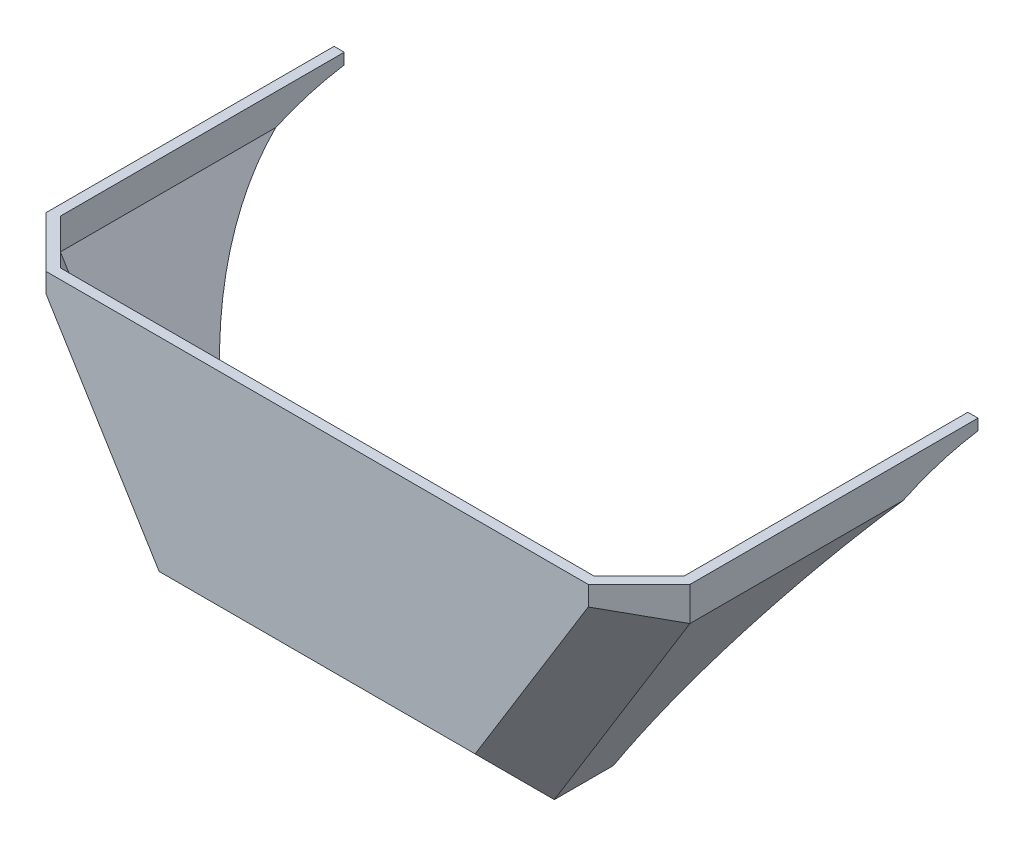
ISO-10303-21;
HEADER;
FILE_DESCRIPTION(('STEP AP214'),'2;1');
FILE_NAME('part.step','',(''),(''),'','','');
FILE_SCHEMA(('AUTOMOTIVE_DESIGN { 1 0 10303 214 1 1 1 1 }'));
ENDSEC;
DATA;
#1=APPLICATION_CONTEXT('core data for automotive mechanical design processes');
#2=APPLICATION_PROTOCOL_DEFINITION('international standard','automotive_design',2000,#1);
#3=PRODUCT_CONTEXT('',#1,'mechanical');
#4=PRODUCT('Part','Part','',(#3));
#5=PRODUCT_RELATED_PRODUCT_CATEGORY('part','',(#4));
#6=PRODUCT_DEFINITION_FORMATION('','',#4);
#7=PRODUCT_DEFINITION_CONTEXT('part definition',#1,'design');
#8=PRODUCT_DEFINITION('design','',#6,#7);
#9=PRODUCT_DEFINITION_SHAPE('','',#8);
#10=(LENGTH_UNIT() NAMED_UNIT(*) SI_UNIT(.MILLI.,.METRE.));
#11=(NAMED_UNIT(*) PLANE_ANGLE_UNIT() SI_UNIT($,.RADIAN.));
#12=(NAMED_UNIT(*) SI_UNIT($,.STERADIAN.) SOLID_ANGLE_UNIT());
#13=UNCERTAINTY_MEASURE_WITH_UNIT(LENGTH_MEASURE(1.E-05),#10,'distance_accuracy_value','');
#14=(GEOMETRIC_REPRESENTATION_CONTEXT(3) GLOBAL_UNCERTAINTY_ASSIGNED_CONTEXT((#13)) GLOBAL_UNIT_ASSIGNED_CONTEXT((#10,
#11,#12)) REPRESENTATION_CONTEXT('',''));
#15=CARTESIAN_POINT('',(0.,0.,0.));
#16=DIRECTION('',(0.,0.,1.));
#17=DIRECTION('',(1.,0.,0.));
#18=AXIS2_PLACEMENT_3D('',#15,#16,#17);
#19=CARTESIAN_POINT('',(-95.,30.,-100.));
#20=DIRECTION('',(0.,1.,0.));
#21=DIRECTION('',(-1.,0.,0.));
#22=AXIS2_PLACEMENT_3D('',#19,#20,#21);
#23=PLANE('',#22);
#24=DIRECTION('',(-1.,0.,0.));
#25=VECTOR('',#24,1.);
#26=CARTESIAN_POINT('',(-95.,30.,-100.));
#27=LINE('',#26,#25);
#28=CARTESIAN_POINT('',(95.,30.,-100.));
#29=VERTEX_POINT('',#28);
#30=CARTESIAN_POINT('',(92.,30.,-100.));
#31=VERTEX_POINT('',#30);
#32=EDGE_CURVE('E317',#29,#31,#27,.T.);
#33=ORIENTED_EDGE('',*,*,#32,.T.);
#34=DIRECTION('',(0.,0.,1.));
#35=VECTOR('',#34,1.);
#36=CARTESIAN_POINT('',(92.,30.,-100.));
#37=LINE('',#36,#35);
#38=CARTESIAN_POINT('',(92.,30.,-16.2426406871194));
#39=VERTEX_POINT('',#38);
#40=EDGE_CURVE('E248',#31,#39,#37,.T.);
#41=ORIENTED_EDGE('',*,*,#40,.T.);
#42=DIRECTION('',(0.707106781186546,0.,-0.707106781186549));
#43=VECTOR('',#42,1.);
#44=CARTESIAN_POINT('',(40.3786796564407,30.,35.3786796564401));
#45=LINE('',#44,#43);
#46=CARTESIAN_POINT('',(78.7573593128807,30.,-3.));
#47=VERTEX_POINT('',#46);
#48=EDGE_CURVE('E201',#47,#39,#45,.T.);
#49=ORIENTED_EDGE('',*,*,#48,.F.);
#50=DIRECTION('',(-1.,0.,0.));
#51=VECTOR('',#50,1.);
#52=CARTESIAN_POINT('',(-95.,30.,-3.));
#53=LINE('',#52,#51);
#54=CARTESIAN_POINT('',(-78.7573593128807,30.,-3.));
#55=VERTEX_POINT('',#54);
#56=EDGE_CURVE('E255',#47,#55,#53,.T.);
#57=ORIENTED_EDGE('',*,*,#56,.T.);
#58=DIRECTION('',(0.707106781186546,0.,0.707106781186549));
#59=VECTOR('',#58,1.);
#60=CARTESIAN_POINT('',(-135.37867965644,30.,-59.6213203435599));
#61=LINE('',#60,#59);
#62=CARTESIAN_POINT('',(-92.,30.,-16.2426406871194));
#63=VERTEX_POINT('',#62);
#64=EDGE_CURVE('E285',#63,#55,#61,.T.);
#65=ORIENTED_EDGE('',*,*,#64,.F.);
#66=DIRECTION('',(0.,0.,1.));
#67=VECTOR('',#66,1.);
#68=CARTESIAN_POINT('',(-92.,30.,-100.));
#69=LINE('',#68,#67);
#70=CARTESIAN_POINT('',(-92.,30.,-100.));
#71=VERTEX_POINT('',#70);
#72=EDGE_CURVE('E251',#71,#63,#69,.T.);
#73=ORIENTED_EDGE('',*,*,#72,.F.);
#74=CARTESIAN_POINT('',(-95.,30.,-100.));
#75=VERTEX_POINT('',#74);
#76=EDGE_CURVE('E316',#71,#75,#27,.T.);
#77=ORIENTED_EDGE('',*,*,#76,.T.);
#78=DIRECTION('',(0.,0.,1.));
#79=VECTOR('',#78,1.);
#80=CARTESIAN_POINT('',(-95.,30.,-100.));
#81=LINE('',#80,#79);
#82=CARTESIAN_POINT('',(-95.,30.,-15.0000000000001));
#83=VERTEX_POINT('',#82);
#84=EDGE_CURVE('E344',#75,#83,#81,.T.);
#85=ORIENTED_EDGE('',*,*,#84,.T.);
#86=DIRECTION('',(0.707106781186546,0.,0.707106781186549));
#87=VECTOR('',#86,1.);
#88=CARTESIAN_POINT('',(-137.5,30.,-57.5000000000002));
#89=LINE('',#88,#87);
#90=CARTESIAN_POINT('',(-80.,30.,0.));
#91=VERTEX_POINT('',#90);
#92=EDGE_CURVE('E371',#83,#91,#89,.T.);
#93=ORIENTED_EDGE('',*,*,#92,.T.);
#94=DIRECTION('',(-1.,0.,0.));
#95=VECTOR('',#94,1.);
#96=CARTESIAN_POINT('',(-95.,30.,0.));
#97=LINE('',#96,#95);
#98=CARTESIAN_POINT('',(80.,30.,0.));
#99=VERTEX_POINT('',#98);
#100=EDGE_CURVE('E312',#99,#91,#97,.T.);
#101=ORIENTED_EDGE('',*,*,#100,.F.);
#102=DIRECTION('',(0.707106781186546,0.,-0.707106781186549));
#103=VECTOR('',#102,1.);
#104=CARTESIAN_POINT('',(42.5000000000003,30.,37.4999999999998));
#105=LINE('',#104,#103);
#106=CARTESIAN_POINT('',(95.,30.,-15.0000000000001));
#107=VERTEX_POINT('',#106);
#108=EDGE_CURVE('E374',#99,#107,#105,.T.);
#109=ORIENTED_EDGE('',*,*,#108,.T.);
#110=DIRECTION('',(0.,0.,1.));
#111=VECTOR('',#110,1.);
#112=CARTESIAN_POINT('',(95.,30.,-100.));
#113=LINE('',#112,#111);
#114=EDGE_CURVE('E325',#29,#107,#113,.T.);
#115=ORIENTED_EDGE('',*,*,#114,.F.);
#116=EDGE_LOOP('',(#33,#41,#49,#57,#65,#73,#77,#85,#93,#101,#109,#115));
#117=FACE_BOUND('',#116,.T.);
#118=ADVANCED_FACE('F47',(#117),#23,.T.);
#119=CARTESIAN_POINT('',(0.,0.,-100.));
#120=DIRECTION('',(0.,0.,-1.));
#121=DIRECTION('',(-1.,0.,0.));
#122=AXIS2_PLACEMENT_3D('',#119,#120,#121);
#123=PLANE('',#122);
#124=ORIENTED_EDGE('',*,*,#76,.F.);
#125=DIRECTION('',(0.,-1.,0.));
#126=VECTOR('',#125,1.);
#127=CARTESIAN_POINT('',(-92.,20.,-100.));
#128=LINE('',#127,#126);
#129=CARTESIAN_POINT('',(-92.,26.7439541982686,-100.));
#130=VERTEX_POINT('',#129);
#131=EDGE_CURVE('E252',#71,#130,#128,.T.);
#132=ORIENTED_EDGE('',*,*,#131,.T.);
#133=DIRECTION('',(1.,0.,0.));
#134=VECTOR('',#133,1.);
#135=CARTESIAN_POINT('',(-95.,26.7439541982686,-100.));
#136=LINE('',#135,#134);
#137=CARTESIAN_POINT('',(-95.,26.7439541982686,-100.));
#138=VERTEX_POINT('',#137);
#139=EDGE_CURVE('E351',#138,#130,#136,.T.);
#140=ORIENTED_EDGE('',*,*,#139,.F.);
#141=DIRECTION('',(0.,-1.,0.));
#142=VECTOR('',#141,1.);
#143=CARTESIAN_POINT('',(-95.,20.,-100.));
#144=LINE('',#143,#142);
#145=EDGE_CURVE('E321',#75,#138,#144,.T.);
#146=ORIENTED_EDGE('',*,*,#145,.F.);
#147=EDGE_LOOP('',(#124,#132,#140,#146));
#148=FACE_BOUND('',#147,.T.);
#149=ADVANCED_FACE('F466',(#148),#123,.T.);
#150=CARTESIAN_POINT('',(92.,26.7439541982686,-100.));
#151=VERTEX_POINT('',#150);
#152=CARTESIAN_POINT('',(95.,26.7439541982686,-100.));
#153=VERTEX_POINT('',#152);
#154=EDGE_CURVE('E333',#151,#153,#136,.T.);
#155=ORIENTED_EDGE('',*,*,#154,.F.);
#156=DIRECTION('',(0.,1.,0.));
#157=VECTOR('',#156,1.);
#158=CARTESIAN_POINT('',(92.,20.,-100.));
#159=LINE('',#158,#157);
#160=EDGE_CURVE('E66',#151,#31,#159,.T.);
#161=ORIENTED_EDGE('',*,*,#160,.T.);
#162=ORIENTED_EDGE('',*,*,#32,.F.);
#163=DIRECTION('',(0.,1.,0.));
#164=VECTOR('',#163,1.);
#165=CARTESIAN_POINT('',(95.,20.,-100.));
#166=LINE('',#165,#164);
#167=EDGE_CURVE('E313',#153,#29,#166,.T.);
#168=ORIENTED_EDGE('',*,*,#167,.F.);
#169=EDGE_LOOP('',(#155,#161,#162,#168));
#170=FACE_BOUND('',#169,.T.);
#171=ADVANCED_FACE('F471',(#170),#123,.T.);
#172=CARTESIAN_POINT('',(-95.,-52.3362331195292,-112.096444675276));
#173=DIRECTION('',(1.,0.,0.));
#174=DIRECTION('',(0.,0.,-1.));
#175=AXIS2_PLACEMENT_3D('',#172,#173,#174);
#176=CYLINDRICAL_SURFACE('',#175,80.);
#177=CARTESIAN_POINT('',(-46.9628555751035,-52.3362331195292,-112.096444675276));
#178=DIRECTION('',(-0.851658316704544,-0.524097425664335,0.));
#179=DIRECTION('',(0.524097425664335,-0.851658316704544,0.));
#180=AXIS2_PLACEMENT_3D('',#177,#178,#179);
#181=ELLIPSE('',#180,93.9343847536846,80.);
#182=CARTESIAN_POINT('',(-51.4774605717368,-45.,-32.4335318260965));
#183=VERTEX_POINT('',#182);
#184=CARTESIAN_POINT('',(-92.,20.8491265709276,-79.7869549396198));
#185=VERTEX_POINT('',#184);
#186=EDGE_CURVE('E263',#183,#185,#181,.T.);
#187=ORIENTED_EDGE('',*,*,#186,.F.);
#188=DIRECTION('',(1.,0.,0.));
#189=VECTOR('',#188,1.);
#190=CARTESIAN_POINT('',(-95.,-45.,-32.4335318260965));
#191=LINE('',#190,#189);
#192=CARTESIAN_POINT('',(-55.,-45.,-32.4335318260965));
#193=VERTEX_POINT('',#192);
#194=EDGE_CURVE('E304',#183,#193,#191,.F.);
#195=ORIENTED_EDGE('',*,*,#194,.T.);
#196=CARTESIAN_POINT('',(-50.4853950033666,-52.3362331195292,-112.096444675276));
#197=DIRECTION('',(-0.851658316704544,-0.524097425664335,0.));
#198=DIRECTION('',(0.524097425664335,-0.851658316704544,0.));
#199=AXIS2_PLACEMENT_3D('',#196,#197,#198);
#200=ELLIPSE('',#199,93.9343847536846,80.);
#201=CARTESIAN_POINT('',(-95.,20.,-77.9281936507189));
#202=VERTEX_POINT('',#201);
#203=EDGE_CURVE('E301',#193,#202,#200,.T.);
#204=ORIENTED_EDGE('',*,*,#203,.T.);
#205=CARTESIAN_POINT('',(-95.,-52.3362331195292,-112.096444675276));
#206=DIRECTION('',(1.,0.,0.));
#207=DIRECTION('',(0.,0.,-1.));
#208=AXIS2_PLACEMENT_3D('',#205,#206,#207);
#209=CIRCLE('',#208,80.);
#210=EDGE_CURVE('E297',#138,#202,#209,.T.);
#211=ORIENTED_EDGE('',*,*,#210,.F.);
#212=ORIENTED_EDGE('',*,*,#139,.T.);
#213=CARTESIAN_POINT('',(-92.,-52.3362331195292,-112.096444675276));
#214=DIRECTION('',(-1.,0.,0.));
#215=DIRECTION('',(0.,0.,1.));
#216=AXIS2_PLACEMENT_3D('',#213,#214,#215);
#217=CIRCLE('',#216,80.);
#218=EDGE_CURVE('E258',#130,#185,#217,.F.);
#219=ORIENTED_EDGE('',*,*,#218,.T.);
#220=EDGE_LOOP('',(#187,#195,#204,#211,#212,#219));
#221=FACE_BOUND('',#220,.T.);
#222=ADVANCED_FACE('F427',(#221),#176,.F.);
#223=CARTESIAN_POINT('',(46.9628555751035,-52.3362331195292,-112.096444675276));
#224=DIRECTION('',(0.851658316704544,-0.524097425664335,0.));
#225=DIRECTION('',(0.524097425664335,0.851658316704544,0.));
#226=AXIS2_PLACEMENT_3D('',#223,#224,#225);
#227=ELLIPSE('',#226,93.9343847536846,80.);
#228=CARTESIAN_POINT('',(92.,20.8491265709277,-79.7869549396199));
#229=VERTEX_POINT('',#228);
#230=CARTESIAN_POINT('',(51.4774605717368,-45.,-32.4335318260965));
#231=VERTEX_POINT('',#230);
#232=EDGE_CURVE('E260',#229,#231,#227,.T.);
#233=ORIENTED_EDGE('',*,*,#232,.F.);
#234=CARTESIAN_POINT('',(92.,-52.3362331195292,-112.096444675276));
#235=DIRECTION('',(1.,0.,0.));
#236=DIRECTION('',(0.,0.,-1.));
#237=AXIS2_PLACEMENT_3D('',#234,#235,#236);
#238=CIRCLE('',#237,80.);
#239=EDGE_CURVE('E210',#151,#229,#238,.T.);
#240=ORIENTED_EDGE('',*,*,#239,.F.);
#241=ORIENTED_EDGE('',*,*,#154,.T.);
#242=CARTESIAN_POINT('',(95.,-52.3362331195292,-112.096444675276));
#243=DIRECTION('',(1.,0.,0.));
#244=DIRECTION('',(0.,0.,-1.));
#245=AXIS2_PLACEMENT_3D('',#242,#243,#244);
#246=CIRCLE('',#245,80.);
#247=CARTESIAN_POINT('',(95.,20.,-77.928193650719));
#248=VERTEX_POINT('',#247);
#249=EDGE_CURVE('E294',#153,#248,#246,.T.);
#250=ORIENTED_EDGE('',*,*,#249,.T.);
#251=CARTESIAN_POINT('',(50.4853950033666,-52.3362331195292,-112.096444675276));
#252=DIRECTION('',(0.851658316704544,-0.524097425664335,0.));
#253=DIRECTION('',(0.524097425664335,0.851658316704544,0.));
#254=AXIS2_PLACEMENT_3D('',#251,#252,#253);
#255=ELLIPSE('',#254,93.9343847536846,80.);
#256=CARTESIAN_POINT('',(55.,-45.,-32.4335318260965));
#257=VERTEX_POINT('',#256);
#258=EDGE_CURVE('E309',#248,#257,#255,.T.);
#259=ORIENTED_EDGE('',*,*,#258,.T.);
#260=EDGE_CURVE('E305',#257,#231,#191,.F.);
#261=ORIENTED_EDGE('',*,*,#260,.T.);
#262=EDGE_LOOP('',(#233,#240,#241,#250,#259,#261));
#263=FACE_BOUND('',#262,.T.);
#264=ADVANCED_FACE('F477',(#263),#176,.F.);
#265=CARTESIAN_POINT('',(95.,20.,-100.));
#266=DIRECTION('',(1.,0.,0.));
#267=DIRECTION('',(0.,0.,-1.));
#268=AXIS2_PLACEMENT_3D('',#265,#266,#267);
#269=PLANE('',#268);
#270=ORIENTED_EDGE('',*,*,#114,.T.);
#271=DIRECTION('',(0.,-1.,0.));
#272=VECTOR('',#271,1.);
#273=CARTESIAN_POINT('',(95.,20.,-15.0000000000001));
#274=LINE('',#273,#272);
#275=CARTESIAN_POINT('',(95.,20.,-15.0000000000001));
#276=VERTEX_POINT('',#275);
#277=EDGE_CURVE('E377',#107,#276,#274,.T.);
#278=ORIENTED_EDGE('',*,*,#277,.T.);
#279=DIRECTION('',(0.,0.,1.));
#280=VECTOR('',#279,1.);
#281=CARTESIAN_POINT('',(95.,20.,-100.));
#282=LINE('',#281,#280);
#283=EDGE_CURVE('E329',#248,#276,#282,.T.);
#284=ORIENTED_EDGE('',*,*,#283,.F.);
#285=ORIENTED_EDGE('',*,*,#249,.F.);
#286=ORIENTED_EDGE('',*,*,#167,.T.);
#287=EDGE_LOOP('',(#270,#278,#284,#285,#286));
#288=FACE_BOUND('',#287,.T.);
#289=ADVANCED_FACE('F450',(#288),#269,.T.);
#290=CARTESIAN_POINT('',(95.,20.,-100.));
#291=DIRECTION('',(0.851658316704544,-0.524097425664335,0.));
#292=DIRECTION('',(0.524097425664335,0.851658316704544,0.));
#293=AXIS2_PLACEMENT_3D('',#290,#291,#292);
#294=PLANE('',#293);
#295=ORIENTED_EDGE('',*,*,#283,.T.);
#296=DIRECTION('',(-0.524097425664335,-0.851658316704544,0.));
#297=VECTOR('',#296,1.);
#298=CARTESIAN_POINT('',(55.,-45.,-15.0000000000001));
#299=LINE('',#298,#297);
#300=CARTESIAN_POINT('',(55.,-45.,-15.0000000000001));
#301=VERTEX_POINT('',#300);
#302=EDGE_CURVE('E380',#276,#301,#299,.T.);
#303=ORIENTED_EDGE('',*,*,#302,.T.);
#304=DIRECTION('',(0.,0.,1.));
#305=VECTOR('',#304,1.);
#306=CARTESIAN_POINT('',(55.,-45.,-100.));
#307=LINE('',#306,#305);
#308=EDGE_CURVE('E334',#257,#301,#307,.T.);
#309=ORIENTED_EDGE('',*,*,#308,.F.);
#310=ORIENTED_EDGE('',*,*,#258,.F.);
#311=EDGE_LOOP('',(#295,#303,#309,#310));
#312=FACE_BOUND('',#311,.T.);
#313=ADVANCED_FACE('F476',(#312),#294,.T.);
#314=CARTESIAN_POINT('',(-55.,-45.,-100.));
#315=DIRECTION('',(0.,-1.,0.));
#316=DIRECTION('',(1.,0.,0.));
#317=AXIS2_PLACEMENT_3D('',#314,#315,#316);
#318=PLANE('',#317);
#319=DIRECTION('',(0.,0.,1.));
#320=VECTOR('',#319,1.);
#321=CARTESIAN_POINT('',(51.4774605717369,-45.,-100.));
#322=LINE('',#321,#320);
#323=CARTESIAN_POINT('',(51.4774605717369,-45.,-19.2426406871194));
#324=VERTEX_POINT('',#323);
#325=EDGE_CURVE('E215',#231,#324,#322,.T.);
#326=ORIENTED_EDGE('',*,*,#325,.F.);
#327=ORIENTED_EDGE('',*,*,#260,.F.);
#328=ORIENTED_EDGE('',*,*,#308,.T.);
#329=DIRECTION('',(-1.,0.,0.));
#330=VECTOR('',#329,1.);
#331=CARTESIAN_POINT('',(-55.,-45.,-15.0000000000001));
#332=LINE('',#331,#330);
#333=CARTESIAN_POINT('',(-55.,-45.,-15.0000000000001));
#334=VERTEX_POINT('',#333);
#335=EDGE_CURVE('E383',#301,#334,#332,.T.);
#336=ORIENTED_EDGE('',*,*,#335,.T.);
#337=DIRECTION('',(0.,0.,1.));
#338=VECTOR('',#337,1.);
#339=CARTESIAN_POINT('',(-55.,-45.,-100.));
#340=LINE('',#339,#338);
#341=EDGE_CURVE('E338',#193,#334,#340,.T.);
#342=ORIENTED_EDGE('',*,*,#341,.F.);
#343=ORIENTED_EDGE('',*,*,#194,.F.);
#344=DIRECTION('',(0.,0.,1.));
#345=VECTOR('',#344,1.);
#346=CARTESIAN_POINT('',(-51.4774605717368,-45.,-100.));
#347=LINE('',#346,#345);
#348=CARTESIAN_POINT('',(-51.4774605717368,-45.,-19.2426406871194));
#349=VERTEX_POINT('',#348);
#350=EDGE_CURVE('E266',#183,#349,#347,.T.);
#351=ORIENTED_EDGE('',*,*,#350,.T.);
#352=DIRECTION('',(-1.,0.,0.));
#353=VECTOR('',#352,1.);
#354=CARTESIAN_POINT('',(-55.,-45.,-19.2426406871194));
#355=LINE('',#354,#353);
#356=EDGE_CURVE('E225',#324,#349,#355,.T.);
#357=ORIENTED_EDGE('',*,*,#356,.F.);
#358=EDGE_LOOP('',(#326,#327,#328,#336,#342,#343,#351,#357));
#359=FACE_BOUND('',#358,.T.);
#360=ADVANCED_FACE('F432',(#359),#318,.T.);
#361=CARTESIAN_POINT('',(-95.,20.,-100.));
#362=DIRECTION('',(-0.851658316704544,-0.524097425664335,0.));
#363=DIRECTION('',(0.524097425664335,-0.851658316704544,0.));
#364=AXIS2_PLACEMENT_3D('',#361,#362,#363);
#365=PLANE('',#364);
#366=ORIENTED_EDGE('',*,*,#341,.T.);
#367=DIRECTION('',(-0.524097425664335,0.851658316704544,0.));
#368=VECTOR('',#367,1.);
#369=CARTESIAN_POINT('',(-95.,20.,-15.0000000000001));
#370=LINE('',#369,#368);
#371=CARTESIAN_POINT('',(-95.,20.,-15.0000000000001));
#372=VERTEX_POINT('',#371);
#373=EDGE_CURVE('E58',#334,#372,#370,.T.);
#374=ORIENTED_EDGE('',*,*,#373,.T.);
#375=DIRECTION('',(0.,0.,1.));
#376=VECTOR('',#375,1.);
#377=CARTESIAN_POINT('',(-95.,20.,-100.));
#378=LINE('',#377,#376);
#379=EDGE_CURVE('E341',#202,#372,#378,.T.);
#380=ORIENTED_EDGE('',*,*,#379,.F.);
#381=ORIENTED_EDGE('',*,*,#203,.F.);
#382=EDGE_LOOP('',(#366,#374,#380,#381));
#383=FACE_BOUND('',#382,.T.);
#384=ADVANCED_FACE('F430',(#383),#365,.T.);
#385=CARTESIAN_POINT('',(-95.,20.,-100.));
#386=DIRECTION('',(-1.,0.,0.));
#387=DIRECTION('',(0.,0.,1.));
#388=AXIS2_PLACEMENT_3D('',#385,#386,#387);
#389=PLANE('',#388);
#390=ORIENTED_EDGE('',*,*,#379,.T.);
#391=DIRECTION('',(0.,1.,0.));
#392=VECTOR('',#391,1.);
#393=CARTESIAN_POINT('',(-95.,30.,-15.0000000000001));
#394=LINE('',#393,#392);
#395=EDGE_CURVE('E11',#372,#83,#394,.T.);
#396=ORIENTED_EDGE('',*,*,#395,.T.);
#397=ORIENTED_EDGE('',*,*,#84,.F.);
#398=ORIENTED_EDGE('',*,*,#145,.T.);
#399=ORIENTED_EDGE('',*,*,#210,.T.);
#400=EDGE_LOOP('',(#390,#396,#397,#398,#399));
#401=FACE_BOUND('',#400,.T.);
#402=ADVANCED_FACE('F413',(#401),#389,.T.);
#403=CARTESIAN_POINT('',(0.,0.,0.));
#404=DIRECTION('',(0.,0.,-1.));
#405=DIRECTION('',(-1.,0.,0.));
#406=AXIS2_PLACEMENT_3D('',#403,#404,#405);
#407=PLANE('',#406);
#408=DIRECTION('',(0.524097425664335,0.851658316704544,0.));
#409=VECTOR('',#408,1.);
#410=CARTESIAN_POINT('',(82.2251252494318,27.8614613849651,0.));
#411=LINE('',#410,#409);
#412=CARTESIAN_POINT('',(46.6180720894533,-29.9999999999999,0.));
#413=VERTEX_POINT('',#412);
#414=CARTESIAN_POINT('',(80.,24.2456328546383,0.));
#415=VERTEX_POINT('',#414);
#416=EDGE_CURVE('E364',#413,#415,#411,.T.);
#417=ORIENTED_EDGE('',*,*,#416,.T.);
#418=DIRECTION('',(0.,1.,0.));
#419=VECTOR('',#418,1.);
#420=CARTESIAN_POINT('',(80.,30.,0.));
#421=LINE('',#420,#419);
#422=EDGE_CURVE('E367',#415,#99,#421,.T.);
#423=ORIENTED_EDGE('',*,*,#422,.T.);
#424=ORIENTED_EDGE('',*,*,#100,.T.);
#425=DIRECTION('',(0.,-1.,0.));
#426=VECTOR('',#425,1.);
#427=CARTESIAN_POINT('',(-80.,20.,0.));
#428=LINE('',#427,#426);
#429=CARTESIAN_POINT('',(-80.,24.2456328546383,0.));
#430=VERTEX_POINT('',#429);
#431=EDGE_CURVE('E355',#91,#430,#428,.T.);
#432=ORIENTED_EDGE('',*,*,#431,.T.);
#433=DIRECTION('',(0.524097425664335,-0.851658316704544,0.));
#434=VECTOR('',#433,1.);
#435=CARTESIAN_POINT('',(-42.2251252494318,-37.138538615035,0.));
#436=LINE('',#435,#434);
#437=CARTESIAN_POINT('',(-46.6180720894533,-30.,0.));
#438=VERTEX_POINT('',#437);
#439=EDGE_CURVE('E358',#430,#438,#436,.T.);
#440=ORIENTED_EDGE('',*,*,#439,.T.);
#441=DIRECTION('',(1.,0.,0.));
#442=VECTOR('',#441,1.);
#443=CARTESIAN_POINT('',(55.,-29.9999999999999,0.));
#444=LINE('',#443,#442);
#445=EDGE_CURVE('E361',#438,#413,#444,.T.);
#446=ORIENTED_EDGE('',*,*,#445,.T.);
#447=EDGE_LOOP('',(#417,#423,#424,#432,#440,#446));
#448=FACE_BOUND('',#447,.T.);
#449=ADVANCED_FACE('F444',(#448),#407,.F.);
#450=CARTESIAN_POINT('',(-80.,0.,0.));
#451=DIRECTION('',(-0.707106781186549,0.,0.707106781186546));
#452=DIRECTION('',(0.,1.,0.));
#453=AXIS2_PLACEMENT_3D('',#450,#451,#452);
#454=PLANE('',#453);
#455=ORIENTED_EDGE('',*,*,#92,.F.);
#456=ORIENTED_EDGE('',*,*,#395,.F.);
#457=DIRECTION('',(0.693356431327519,0.196249122987926,0.693356431327522));
#458=VECTOR('',#457,1.);
#459=CARTESIAN_POINT('',(-83.2991176054242,23.3118433815113,-3.29911760542424));
#460=LINE('',#459,#458);
#461=EDGE_CURVE('E52',#430,#372,#460,.F.);
#462=ORIENTED_EDGE('',*,*,#461,.F.);
#463=ORIENTED_EDGE('',*,*,#431,.F.);
#464=EDGE_LOOP('',(#455,#456,#462,#463));
#465=FACE_BOUND('',#464,.T.);
#466=ADVANCED_FACE('F50',(#465),#454,.T.);
#467=CARTESIAN_POINT('',(-47.203666021964,-29.0484098596701,0.));
#468=DIRECTION('',(-0.602213370995704,-0.370592843689664,0.707106781186547));
#469=DIRECTION('',(-0.524097425664335,0.851658316704544,0.));
#470=AXIS2_PLACEMENT_3D('',#467,#468,#469);
#471=PLANE('',#470);
#472=ORIENTED_EDGE('',*,*,#461,.T.);
#473=ORIENTED_EDGE('',*,*,#373,.F.);
#474=DIRECTION('',(0.367481156033563,0.657631203624126,0.657631203624128));
#475=VECTOR('',#474,1.);
#476=CARTESIAN_POINT('',(-46.4671840937821,-29.7299762108164,0.27002378918353));
#477=LINE('',#476,#475);
#478=EDGE_CURVE('E394',#438,#334,#477,.F.);
#479=ORIENTED_EDGE('',*,*,#478,.F.);
#480=ORIENTED_EDGE('',*,*,#439,.F.);
#481=EDGE_LOOP('',(#472,#473,#479,#480));
#482=FACE_BOUND('',#481,.T.);
#483=ADVANCED_FACE('F406',(#482),#471,.T.);
#484=CARTESIAN_POINT('',(0.,-30.,0.));
#485=DIRECTION('',(0.,-0.707106781186549,0.707106781186546));
#486=DIRECTION('',(-1.,0.,0.));
#487=AXIS2_PLACEMENT_3D('',#484,#485,#486);
#488=PLANE('',#487);
#489=ORIENTED_EDGE('',*,*,#478,.T.);
#490=ORIENTED_EDGE('',*,*,#335,.F.);
#491=DIRECTION('',(-0.367481156033562,0.657631203624126,0.657631203624128));
#492=VECTOR('',#491,1.);
#493=CARTESIAN_POINT('',(40.3226557492669,-18.7339468782619,11.2660531217381));
#494=LINE('',#493,#492);
#495=EDGE_CURVE('E391',#413,#301,#494,.F.);
#496=ORIENTED_EDGE('',*,*,#495,.F.);
#497=ORIENTED_EDGE('',*,*,#445,.F.);
#498=EDGE_LOOP('',(#489,#490,#496,#497));
#499=FACE_BOUND('',#498,.T.);
#500=ADVANCED_FACE('F436',(#499),#488,.T.);
#501=CARTESIAN_POINT('',(47.203666021964,-29.0484098596701,0.));
#502=DIRECTION('',(0.602213370995704,-0.370592843689664,0.707106781186546));
#503=DIRECTION('',(-0.524097425664335,-0.851658316704544,0.));
#504=AXIS2_PLACEMENT_3D('',#501,#502,#503);
#505=PLANE('',#504);
#506=ORIENTED_EDGE('',*,*,#495,.T.);
#507=ORIENTED_EDGE('',*,*,#302,.F.);
#508=DIRECTION('',(-0.69335643132752,0.196249122987924,0.693356431327522));
#509=VECTOR('',#508,1.);
#510=CARTESIAN_POINT('',(71.4851393136823,26.6556976734715,8.51486068631767));
#511=LINE('',#510,#509);
#512=EDGE_CURVE('E247',#415,#276,#511,.F.);
#513=ORIENTED_EDGE('',*,*,#512,.F.);
#514=ORIENTED_EDGE('',*,*,#416,.F.);
#515=EDGE_LOOP('',(#506,#507,#513,#514));
#516=FACE_BOUND('',#515,.T.);
#517=ADVANCED_FACE('F440',(#516),#505,.T.);
#518=CARTESIAN_POINT('',(80.,0.,0.));
#519=DIRECTION('',(0.707106781186549,0.,0.707106781186546));
#520=DIRECTION('',(0.,-1.,0.));
#521=AXIS2_PLACEMENT_3D('',#518,#519,#520);
#522=PLANE('',#521);
#523=ORIENTED_EDGE('',*,*,#512,.T.);
#524=ORIENTED_EDGE('',*,*,#277,.F.);
#525=ORIENTED_EDGE('',*,*,#108,.F.);
#526=ORIENTED_EDGE('',*,*,#422,.F.);
#527=EDGE_LOOP('',(#523,#524,#525,#526));
#528=FACE_BOUND('',#527,.T.);
#529=ADVANCED_FACE('F454',(#528),#522,.T.);
#530=CARTESIAN_POINT('',(92.,20.,-100.));
#531=DIRECTION('',(1.,0.,0.));
#532=DIRECTION('',(0.,0.,-1.));
#533=AXIS2_PLACEMENT_3D('',#530,#531,#532);
#534=PLANE('',#533);
#535=ORIENTED_EDGE('',*,*,#40,.F.);
#536=ORIENTED_EDGE('',*,*,#160,.F.);
#537=ORIENTED_EDGE('',*,*,#239,.T.);
#538=DIRECTION('',(0.,0.,1.));
#539=VECTOR('',#538,1.);
#540=CARTESIAN_POINT('',(92.,20.8491265709277,-100.));
#541=LINE('',#540,#539);
#542=CARTESIAN_POINT('',(92.,20.8491265709277,-16.2426406871194));
#543=VERTEX_POINT('',#542);
#544=EDGE_CURVE('E207',#229,#543,#541,.T.);
#545=ORIENTED_EDGE('',*,*,#544,.T.);
#546=DIRECTION('',(0.,-1.,0.));
#547=VECTOR('',#546,1.);
#548=CARTESIAN_POINT('',(92.,20.,-16.2426406871194));
#549=LINE('',#548,#547);
#550=EDGE_CURVE('E194',#39,#543,#549,.T.);
#551=ORIENTED_EDGE('',*,*,#550,.F.);
#552=EDGE_LOOP('',(#535,#536,#537,#545,#551));
#553=FACE_BOUND('',#552,.T.);
#554=ADVANCED_FACE('F209',(#553),#534,.F.);
#555=CARTESIAN_POINT('',(92.4450250498864,21.572292276993,-100.));
#556=DIRECTION('',(0.851658316704544,-0.524097425664335,0.));
#557=DIRECTION('',(0.524097425664335,0.851658316704544,0.));
#558=AXIS2_PLACEMENT_3D('',#555,#556,#557);
#559=PLANE('',#558);
#560=ORIENTED_EDGE('',*,*,#544,.F.);
#561=ORIENTED_EDGE('',*,*,#232,.T.);
#562=ORIENTED_EDGE('',*,*,#325,.T.);
#563=DIRECTION('',(-0.399003734443053,-0.64838106846996,-0.648381068469963));
#564=VECTOR('',#563,1.);
#565=CARTESIAN_POINT('',(54.3298913052424,-40.3648000580535,-14.6074407451729));
#566=LINE('',#565,#564);
#567=CARTESIAN_POINT('',(53.3236144178907,-42.,-16.2426406871194));
#568=VERTEX_POINT('',#567);
#569=EDGE_CURVE('E220',#568,#324,#566,.T.);
#570=ORIENTED_EDGE('',*,*,#569,.F.);
#571=DIRECTION('',(-0.524097425664335,-0.851658316704544,0.));
#572=VECTOR('',#571,1.);
#573=CARTESIAN_POINT('',(92.4450250498864,21.572292276993,-16.2426406871194));
#574=LINE('',#573,#572);
#575=EDGE_CURVE('E204',#543,#568,#574,.T.);
#576=ORIENTED_EDGE('',*,*,#575,.F.);
#577=EDGE_LOOP('',(#560,#561,#562,#570,#576));
#578=FACE_BOUND('',#577,.T.);
#579=ADVANCED_FACE('F218',(#578),#559,.F.);
#580=CARTESIAN_POINT('',(-92.4450250498864,21.572292276993,-100.));
#581=DIRECTION('',(-0.851658316704544,-0.524097425664335,0.));
#582=DIRECTION('',(0.524097425664335,-0.851658316704544,0.));
#583=AXIS2_PLACEMENT_3D('',#580,#581,#582);
#584=PLANE('',#583);
#585=ORIENTED_EDGE('',*,*,#350,.F.);
#586=ORIENTED_EDGE('',*,*,#186,.T.);
#587=DIRECTION('',(0.,0.,1.));
#588=VECTOR('',#587,1.);
#589=CARTESIAN_POINT('',(-92.,20.8491265709276,-100.));
#590=LINE('',#589,#588);
#591=CARTESIAN_POINT('',(-92.,20.8491265709276,-16.2426406871194));
#592=VERTEX_POINT('',#591);
#593=EDGE_CURVE('E273',#185,#592,#590,.T.);
#594=ORIENTED_EDGE('',*,*,#593,.T.);
#595=DIRECTION('',(-0.524097425664335,0.851658316704544,0.));
#596=VECTOR('',#595,1.);
#597=CARTESIAN_POINT('',(-92.4450250498864,21.572292276993,-16.2426406871194));
#598=LINE('',#597,#596);
#599=CARTESIAN_POINT('',(-53.3236144178907,-42.,-16.2426406871194));
#600=VERTEX_POINT('',#599);
#601=EDGE_CURVE('E269',#600,#592,#598,.T.);
#602=ORIENTED_EDGE('',*,*,#601,.F.);
#603=DIRECTION('',(0.399003734443052,-0.64838106846996,-0.648381068469963));
#604=VECTOR('',#603,1.);
#605=CARTESIAN_POINT('',(-52.1408365788743,-43.9220139884016,-18.164654675521));
#606=LINE('',#605,#604);
#607=EDGE_CURVE('E242',#600,#349,#606,.T.);
#608=ORIENTED_EDGE('',*,*,#607,.T.);
#609=EDGE_LOOP('',(#585,#586,#594,#602,#608));
#610=FACE_BOUND('',#609,.T.);
#611=ADVANCED_FACE('F575',(#610),#584,.F.);
#612=CARTESIAN_POINT('',(-92.,20.,-100.));
#613=DIRECTION('',(-1.,0.,0.));
#614=DIRECTION('',(0.,0.,1.));
#615=AXIS2_PLACEMENT_3D('',#612,#613,#614);
#616=PLANE('',#615);
#617=ORIENTED_EDGE('',*,*,#593,.F.);
#618=ORIENTED_EDGE('',*,*,#218,.F.);
#619=ORIENTED_EDGE('',*,*,#131,.F.);
#620=ORIENTED_EDGE('',*,*,#72,.T.);
#621=DIRECTION('',(0.,1.,0.));
#622=VECTOR('',#621,1.);
#623=CARTESIAN_POINT('',(-92.,20.,-16.2426406871194));
#624=LINE('',#623,#622);
#625=EDGE_CURVE('E243',#592,#63,#624,.T.);
#626=ORIENTED_EDGE('',*,*,#625,.F.);
#627=EDGE_LOOP('',(#617,#618,#619,#620,#626));
#628=FACE_BOUND('',#627,.T.);
#629=ADVANCED_FACE('F584',(#628),#616,.F.);
#630=CARTESIAN_POINT('',(0.,0.,-3.));
#631=DIRECTION('',(0.,0.,-1.));
#632=DIRECTION('',(-1.,0.,0.));
#633=AXIS2_PLACEMENT_3D('',#630,#631,#632);
#634=PLANE('',#633);
#635=DIRECTION('',(0.524097425664335,0.851658316704544,0.));
#636=VECTOR('',#635,1.);
#637=CARTESIAN_POINT('',(46.1453607461034,-28.3971450745252,-3.));
#638=LINE('',#637,#636);
#639=CARTESIAN_POINT('',(45.9236904455769,-28.7573593128807,-3.));
#640=VERTEX_POINT('',#639);
#641=CARTESIAN_POINT('',(78.7573593128807,24.5973525964879,-3.));
#642=VERTEX_POINT('',#641);
#643=EDGE_CURVE('E229',#640,#642,#638,.T.);
#644=ORIENTED_EDGE('',*,*,#643,.F.);
#645=DIRECTION('',(1.,0.,0.));
#646=VECTOR('',#645,1.);
#647=CARTESIAN_POINT('',(0.,-28.7573593128807,-3.));
#648=LINE('',#647,#646);
#649=CARTESIAN_POINT('',(-45.9236904455769,-28.7573593128807,-3.));
#650=VERTEX_POINT('',#649);
#651=EDGE_CURVE('E654',#650,#640,#648,.T.);
#652=ORIENTED_EDGE('',*,*,#651,.F.);
#653=DIRECTION('',(0.524097425664335,-0.851658316704544,0.));
#654=VECTOR('',#653,1.);
#655=CARTESIAN_POINT('',(-46.1453607461034,-28.3971450745252,-3.));
#656=LINE('',#655,#654);
#657=CARTESIAN_POINT('',(-78.7573593128807,24.5973525964879,-3.));
#658=VERTEX_POINT('',#657);
#659=EDGE_CURVE('E238',#658,#650,#656,.T.);
#660=ORIENTED_EDGE('',*,*,#659,.F.);
#661=DIRECTION('',(0.,-1.,0.));
#662=VECTOR('',#661,1.);
#663=CARTESIAN_POINT('',(-78.7573593128807,0.,-3.));
#664=LINE('',#663,#662);
#665=EDGE_CURVE('E214',#55,#658,#664,.T.);
#666=ORIENTED_EDGE('',*,*,#665,.F.);
#667=ORIENTED_EDGE('',*,*,#56,.F.);
#668=DIRECTION('',(0.,1.,0.));
#669=VECTOR('',#668,1.);
#670=CARTESIAN_POINT('',(78.7573593128807,0.,-3.));
#671=LINE('',#670,#669);
#672=EDGE_CURVE('E288',#642,#47,#671,.T.);
#673=ORIENTED_EDGE('',*,*,#672,.F.);
#674=EDGE_LOOP('',(#644,#652,#660,#666,#667,#673));
#675=FACE_BOUND('',#674,.T.);
#676=ADVANCED_FACE('F594',(#675),#634,.T.);
#677=CARTESIAN_POINT('',(-77.8786796564403,0.,-2.12132034355964));
#678=DIRECTION('',(-0.707106781186549,0.,0.707106781186546));
#679=DIRECTION('',(0.,1.,0.));
#680=AXIS2_PLACEMENT_3D('',#677,#678,#679);
#681=PLANE('',#680);
#682=ORIENTED_EDGE('',*,*,#64,.T.);
#683=ORIENTED_EDGE('',*,*,#665,.T.);
#684=DIRECTION('',(-0.693356431327519,-0.196249122987926,-0.693356431327522));
#685=VECTOR('',#684,1.);
#686=CARTESIAN_POINT('',(-69.4455189042025,27.2329963015701,6.31184040867818));
#687=LINE('',#686,#685);
#688=EDGE_CURVE('E259',#658,#592,#687,.T.);
#689=ORIENTED_EDGE('',*,*,#688,.T.);
#690=ORIENTED_EDGE('',*,*,#625,.T.);
#691=EDGE_LOOP('',(#682,#683,#689,#690));
#692=FACE_BOUND('',#691,.T.);
#693=ADVANCED_FACE('F604',(#692),#681,.F.);
#694=CARTESIAN_POINT('',(-45.3970259089769,-27.9366313286012,-2.12132034355964));
#695=DIRECTION('',(-0.602213370995704,-0.370592843689664,0.707106781186547));
#696=DIRECTION('',(-0.524097425664335,0.851658316704544,0.));
#697=AXIS2_PLACEMENT_3D('',#694,#695,#696);
#698=PLANE('',#697);
#699=ORIENTED_EDGE('',*,*,#688,.F.);
#700=ORIENTED_EDGE('',*,*,#659,.T.);
#701=DIRECTION('',(-0.367481156033563,-0.657631203624126,-0.657631203624128));
#702=VECTOR('',#701,1.);
#703=CARTESIAN_POINT('',(-39.2973491843403,-16.8990947251497,8.85826458773103));
#704=LINE('',#703,#702);
#705=EDGE_CURVE('E234',#650,#600,#704,.T.);
#706=ORIENTED_EDGE('',*,*,#705,.T.);
#707=ORIENTED_EDGE('',*,*,#601,.T.);
#708=EDGE_LOOP('',(#699,#700,#706,#707));
#709=FACE_BOUND('',#708,.T.);
#710=ADVANCED_FACE('F614',(#709),#698,.F.);
#711=CARTESIAN_POINT('',(0.,-27.8786796564403,-2.12132034355964));
#712=DIRECTION('',(0.,-0.707106781186549,0.707106781186546));
#713=DIRECTION('',(-1.,0.,0.));
#714=AXIS2_PLACEMENT_3D('',#711,#712,#713);
#715=PLANE('',#714);
#716=ORIENTED_EDGE('',*,*,#705,.F.);
#717=ORIENTED_EDGE('',*,*,#651,.T.);
#718=DIRECTION('',(0.367481156033562,-0.657631203624126,-0.657631203624128));
#719=VECTOR('',#718,1.);
#720=CARTESIAN_POINT('',(45.4418775288556,-27.8951240577042,-2.13776474482358));
#721=LINE('',#720,#719);
#722=EDGE_CURVE('E231',#640,#568,#721,.T.);
#723=ORIENTED_EDGE('',*,*,#722,.T.);
#724=ORIENTED_EDGE('',*,*,#569,.T.);
#725=ORIENTED_EDGE('',*,*,#356,.T.);
#726=ORIENTED_EDGE('',*,*,#607,.F.);
#727=EDGE_LOOP('',(#716,#717,#723,#724,#725,#726));
#728=FACE_BOUND('',#727,.T.);
#729=ADVANCED_FACE('F624',(#728),#715,.F.);
#730=CARTESIAN_POINT('',(45.3970259089769,-27.9366313286012,-2.12132034355964));
#731=DIRECTION('',(0.602213370995704,-0.370592843689664,0.707106781186546));
#732=DIRECTION('',(-0.524097425664335,-0.851658316704544,0.));
#733=AXIS2_PLACEMENT_3D('',#730,#731,#732);
#734=PLANE('',#733);
#735=ORIENTED_EDGE('',*,*,#722,.F.);
#736=ORIENTED_EDGE('',*,*,#643,.T.);
#737=DIRECTION('',(0.69335643132752,-0.196249122987924,-0.693356431327522));
#738=VECTOR('',#737,1.);
#739=CARTESIAN_POINT('',(81.2594971959443,23.8891420096099,-5.50213788306361));
#740=LINE('',#739,#738);
#741=EDGE_CURVE('E198',#642,#543,#740,.T.);
#742=ORIENTED_EDGE('',*,*,#741,.T.);
#743=ORIENTED_EDGE('',*,*,#575,.T.);
#744=EDGE_LOOP('',(#735,#736,#742,#743));
#745=FACE_BOUND('',#744,.T.);
#746=ADVANCED_FACE('F227',(#745),#734,.F.);
#747=CARTESIAN_POINT('',(77.8786796564403,0.,-2.12132034355964));
#748=DIRECTION('',(0.707106781186549,0.,0.707106781186546));
#749=DIRECTION('',(0.,-1.,0.));
#750=AXIS2_PLACEMENT_3D('',#747,#748,#749);
#751=PLANE('',#750);
#752=ORIENTED_EDGE('',*,*,#741,.F.);
#753=ORIENTED_EDGE('',*,*,#672,.T.);
#754=ORIENTED_EDGE('',*,*,#48,.T.);
#755=ORIENTED_EDGE('',*,*,#550,.T.);
#756=EDGE_LOOP('',(#752,#753,#754,#755));
#757=FACE_BOUND('',#756,.T.);
#758=ADVANCED_FACE('F196',(#757),#751,.F.);
#759=CLOSED_SHELL('',(#118,#149,#171,#222,#264,#289,#313,#360,#384,#402,#449,#466,#483,#500,
#517,#529,#554,#579,#611,#629,#676,#693,#710,#729,#746,#758));
#760=MANIFOLD_SOLID_BREP('B2',#759);
#761=ADVANCED_BREP_SHAPE_REPRESENTATION('',(#18,#760),#14);
#762=SHAPE_DEFINITION_REPRESENTATION(#9,#761);
ENDSEC;
END-ISO-10303-21;
